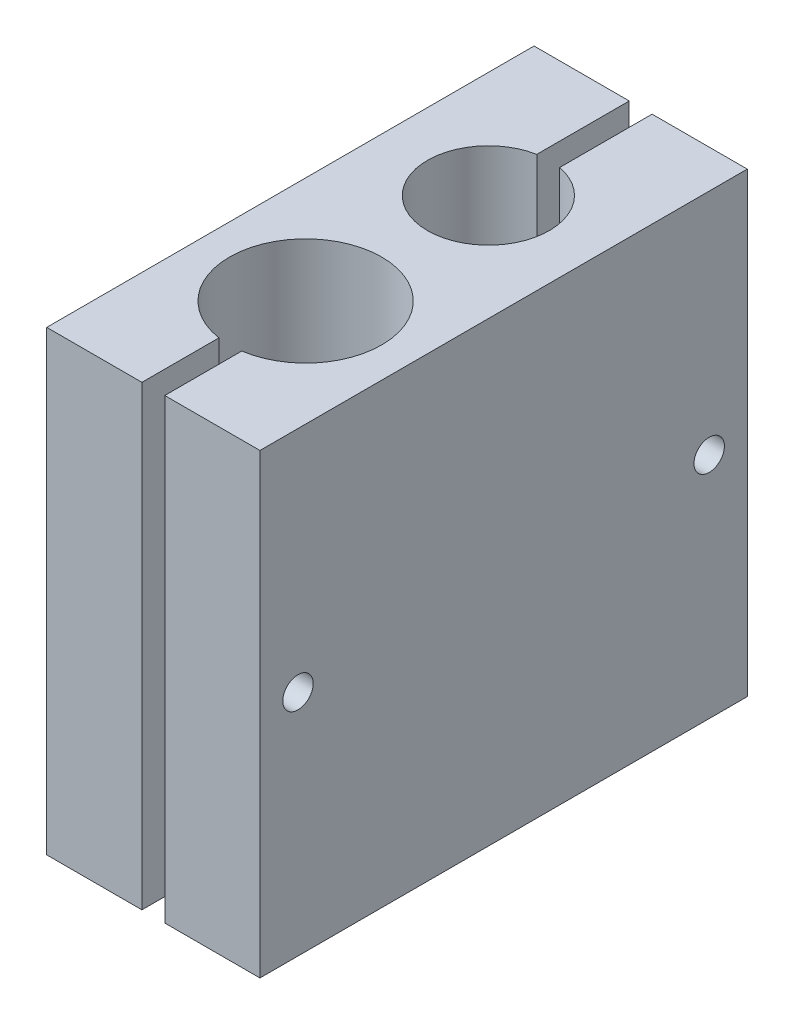
ISO-10303-21;
HEADER;
FILE_DESCRIPTION(('STEP AP214'),'2;1');
FILE_NAME('part.step','',(''),(''),'','','');
FILE_SCHEMA(('AUTOMOTIVE_DESIGN { 1 0 10303 214 1 1 1 1 }'));
ENDSEC;
DATA;
#1=APPLICATION_CONTEXT('core data for automotive mechanical design processes');
#2=APPLICATION_PROTOCOL_DEFINITION('international standard','automotive_design',2000,#1);
#3=PRODUCT_CONTEXT('',#1,'mechanical');
#4=PRODUCT('Part','Part','',(#3));
#5=PRODUCT_RELATED_PRODUCT_CATEGORY('part','',(#4));
#6=PRODUCT_DEFINITION_FORMATION('','',#4);
#7=PRODUCT_DEFINITION_CONTEXT('part definition',#1,'design');
#8=PRODUCT_DEFINITION('design','',#6,#7);
#9=PRODUCT_DEFINITION_SHAPE('','',#8);
#10=(LENGTH_UNIT() NAMED_UNIT(*) SI_UNIT(.MILLI.,.METRE.));
#11=(NAMED_UNIT(*) PLANE_ANGLE_UNIT() SI_UNIT($,.RADIAN.));
#12=(NAMED_UNIT(*) SI_UNIT($,.STERADIAN.) SOLID_ANGLE_UNIT());
#13=UNCERTAINTY_MEASURE_WITH_UNIT(LENGTH_MEASURE(1.E-05),#10,'distance_accuracy_value','');
#14=(GEOMETRIC_REPRESENTATION_CONTEXT(3) GLOBAL_UNCERTAINTY_ASSIGNED_CONTEXT((#13)) GLOBAL_UNIT_ASSIGNED_CONTEXT((#10,
#11,#12)) REPRESENTATION_CONTEXT('',''));
#15=CARTESIAN_POINT('',(0.,0.,0.));
#16=DIRECTION('',(0.,0.,1.));
#17=DIRECTION('',(1.,0.,0.));
#18=AXIS2_PLACEMENT_3D('',#15,#16,#17);
#19=CARTESIAN_POINT('',(-7.,30.,-22.));
#20=DIRECTION('',(0.,0.,1.));
#21=DIRECTION('',(1.,0.,0.));
#22=AXIS2_PLACEMENT_3D('',#19,#20,#21);
#23=PLANE('',#22);
#24=DIRECTION('',(-1.,0.,0.));
#25=VECTOR('',#24,1.);
#26=CARTESIAN_POINT('',(-7.,30.,-22.));
#27=LINE('',#26,#25);
#28=CARTESIAN_POINT('',(-0.749999999999994,30.,-22.));
#29=VERTEX_POINT('',#28);
#30=CARTESIAN_POINT('',(-7.,30.,-22.));
#31=VERTEX_POINT('',#30);
#32=EDGE_CURVE('E173',#29,#31,#27,.T.);
#33=ORIENTED_EDGE('',*,*,#32,.F.);
#34=DIRECTION('',(0.,-1.,0.));
#35=VECTOR('',#34,1.);
#36=CARTESIAN_POINT('',(-0.749999999999994,30.,-22.));
#37=LINE('',#36,#35);
#38=CARTESIAN_POINT('',(-0.749999999999994,0.,-22.));
#39=VERTEX_POINT('',#38);
#40=EDGE_CURVE('E229',#29,#39,#37,.T.);
#41=ORIENTED_EDGE('',*,*,#40,.T.);
#42=DIRECTION('',(-1.,0.,0.));
#43=VECTOR('',#42,1.);
#44=CARTESIAN_POINT('',(-7.,0.,-22.));
#45=LINE('',#44,#43);
#46=CARTESIAN_POINT('',(-7.,0.,-22.));
#47=VERTEX_POINT('',#46);
#48=EDGE_CURVE('E146',#39,#47,#45,.T.);
#49=ORIENTED_EDGE('',*,*,#48,.T.);
#50=DIRECTION('',(0.,-1.,0.));
#51=VECTOR('',#50,1.);
#52=CARTESIAN_POINT('',(-7.,30.,-22.));
#53=LINE('',#52,#51);
#54=EDGE_CURVE('E177',#31,#47,#53,.T.);
#55=ORIENTED_EDGE('',*,*,#54,.F.);
#56=EDGE_LOOP('',(#33,#41,#49,#55));
#57=FACE_BOUND('',#56,.T.);
#58=ADVANCED_FACE('F33',(#57),#23,.F.);
#59=CARTESIAN_POINT('',(-7.,30.,10.));
#60=DIRECTION('',(0.,0.,-1.));
#61=DIRECTION('',(-1.,0.,0.));
#62=AXIS2_PLACEMENT_3D('',#59,#60,#61);
#63=PLANE('',#62);
#64=DIRECTION('',(1.,0.,0.));
#65=VECTOR('',#64,1.);
#66=CARTESIAN_POINT('',(-7.,30.,10.));
#67=LINE('',#66,#65);
#68=CARTESIAN_POINT('',(0.749999999999998,30.,10.));
#69=VERTEX_POINT('',#68);
#70=CARTESIAN_POINT('',(7.,30.,10.));
#71=VERTEX_POINT('',#70);
#72=EDGE_CURVE('E166',#69,#71,#67,.T.);
#73=ORIENTED_EDGE('',*,*,#72,.F.);
#74=DIRECTION('',(0.,-1.,0.));
#75=VECTOR('',#74,1.);
#76=CARTESIAN_POINT('',(0.749999999999998,30.,10.));
#77=LINE('',#76,#75);
#78=CARTESIAN_POINT('',(0.749999999999998,0.,10.));
#79=VERTEX_POINT('',#78);
#80=EDGE_CURVE('E254',#69,#79,#77,.T.);
#81=ORIENTED_EDGE('',*,*,#80,.T.);
#82=DIRECTION('',(1.,0.,0.));
#83=VECTOR('',#82,1.);
#84=CARTESIAN_POINT('',(-7.,0.,10.));
#85=LINE('',#84,#83);
#86=CARTESIAN_POINT('',(7.,0.,10.));
#87=VERTEX_POINT('',#86);
#88=EDGE_CURVE('E180',#79,#87,#85,.T.);
#89=ORIENTED_EDGE('',*,*,#88,.T.);
#90=DIRECTION('',(0.,-1.,0.));
#91=VECTOR('',#90,1.);
#92=CARTESIAN_POINT('',(7.,30.,10.));
#93=LINE('',#92,#91);
#94=EDGE_CURVE('E193',#71,#87,#93,.T.);
#95=ORIENTED_EDGE('',*,*,#94,.F.);
#96=EDGE_LOOP('',(#73,#81,#89,#95));
#97=FACE_BOUND('',#96,.T.);
#98=ADVANCED_FACE('F288',(#97),#63,.F.);
#99=CARTESIAN_POINT('',(0.,30.,0.));
#100=DIRECTION('',(0.,-1.,0.));
#101=DIRECTION('',(0.,0.,-1.));
#102=AXIS2_PLACEMENT_3D('',#99,#100,#101);
#103=CYLINDRICAL_SURFACE('',#102,3.4);
#104=DIRECTION('',(0.,-1.,0.));
#105=VECTOR('',#104,1.);
#106=CARTESIAN_POINT('',(0.75,30.,3.31624787975809));
#107=LINE('',#106,#105);
#108=CARTESIAN_POINT('',(0.75,22.,3.31624787975809));
#109=VERTEX_POINT('',#108);
#110=CARTESIAN_POINT('',(0.75,0.,3.31624787975808));
#111=VERTEX_POINT('',#110);
#112=EDGE_CURVE('E252',#109,#111,#107,.T.);
#113=ORIENTED_EDGE('',*,*,#112,.F.);
#114=CARTESIAN_POINT('',(0.,22.,0.));
#115=DIRECTION('',(0.,1.,0.));
#116=DIRECTION('',(0.,0.,1.));
#117=AXIS2_PLACEMENT_3D('',#114,#115,#116);
#118=CIRCLE('',#117,3.4);
#119=CARTESIAN_POINT('',(-0.750000000000002,22.,3.31624787975809));
#120=VERTEX_POINT('',#119);
#121=EDGE_CURVE('E151',#109,#120,#118,.T.);
#122=ORIENTED_EDGE('',*,*,#121,.T.);
#123=DIRECTION('',(0.,-1.,0.));
#124=VECTOR('',#123,1.);
#125=CARTESIAN_POINT('',(-0.750000000000002,30.,3.31624787975809));
#126=LINE('',#125,#124);
#127=CARTESIAN_POINT('',(-0.750000000000002,0.,3.31624787975808));
#128=VERTEX_POINT('',#127);
#129=EDGE_CURVE('E244',#128,#120,#126,.F.);
#130=ORIENTED_EDGE('',*,*,#129,.F.);
#131=CARTESIAN_POINT('',(0.,0.,0.));
#132=DIRECTION('',(0.,1.,0.));
#133=DIRECTION('',(0.,0.,1.));
#134=AXIS2_PLACEMENT_3D('',#131,#132,#133);
#135=CIRCLE('',#134,3.4);
#136=EDGE_CURVE('E153',#111,#128,#135,.T.);
#137=ORIENTED_EDGE('',*,*,#136,.F.);
#138=EDGE_LOOP('',(#113,#122,#130,#137));
#139=FACE_BOUND('',#138,.T.);
#140=ADVANCED_FACE('F279',(#139),#103,.F.);
#141=CARTESIAN_POINT('',(0.,30.,0.));
#142=DIRECTION('',(0.,-1.,0.));
#143=DIRECTION('',(0.,0.,-1.));
#144=AXIS2_PLACEMENT_3D('',#141,#142,#143);
#145=PLANE('',#144);
#146=CARTESIAN_POINT('',(0.,30.,-12.));
#147=DIRECTION('',(0.,1.,0.));
#148=DIRECTION('',(0.,0.,1.));
#149=AXIS2_PLACEMENT_3D('',#146,#147,#148);
#150=CIRCLE('',#149,4.);
#151=CARTESIAN_POINT('',(-0.749999999999994,30.,-15.9290584113754));
#152=VERTEX_POINT('',#151);
#153=CARTESIAN_POINT('',(0.749999999999997,30.,-15.9290584113754));
#154=VERTEX_POINT('',#153);
#155=EDGE_CURVE('E150',#152,#154,#150,.T.);
#156=ORIENTED_EDGE('',*,*,#155,.F.);
#157=DIRECTION('',(0.,0.,-1.));
#158=VECTOR('',#157,1.);
#159=CARTESIAN_POINT('',(-0.749999999999993,30.,-32.0000000000002));
#160=LINE('',#159,#158);
#161=EDGE_CURVE('E57',#152,#29,#160,.T.);
#162=ORIENTED_EDGE('',*,*,#161,.T.);
#163=ORIENTED_EDGE('',*,*,#32,.T.);
#164=DIRECTION('',(0.,0.,1.));
#165=VECTOR('',#164,1.);
#166=CARTESIAN_POINT('',(-7.,30.,10.));
#167=LINE('',#166,#165);
#168=CARTESIAN_POINT('',(-7.,30.,10.));
#169=VERTEX_POINT('',#168);
#170=EDGE_CURVE('E163',#31,#169,#167,.T.);
#171=ORIENTED_EDGE('',*,*,#170,.T.);
#172=CARTESIAN_POINT('',(-0.750000000000003,30.,10.));
#173=VERTEX_POINT('',#172);
#174=EDGE_CURVE('E168',#169,#173,#67,.T.);
#175=ORIENTED_EDGE('',*,*,#174,.T.);
#176=DIRECTION('',(0.,0.,-1.));
#177=VECTOR('',#176,1.);
#178=CARTESIAN_POINT('',(-0.750000000000004,30.,19.9999999999999));
#179=LINE('',#178,#177);
#180=CARTESIAN_POINT('',(-0.750000000000002,30.,4.9434299833213));
#181=VERTEX_POINT('',#180);
#182=EDGE_CURVE('E235',#173,#181,#179,.T.);
#183=ORIENTED_EDGE('',*,*,#182,.T.);
#184=CARTESIAN_POINT('',(0.,30.,0.));
#185=DIRECTION('',(0.,1.,0.));
#186=DIRECTION('',(0.,0.,1.));
#187=AXIS2_PLACEMENT_3D('',#184,#185,#186);
#188=CIRCLE('',#187,5.);
#189=CARTESIAN_POINT('',(0.75,30.,4.9434299833213));
#190=VERTEX_POINT('',#189);
#191=EDGE_CURVE('E257',#190,#181,#188,.T.);
#192=ORIENTED_EDGE('',*,*,#191,.F.);
#193=DIRECTION('',(0.,0.,1.));
#194=VECTOR('',#193,1.);
#195=CARTESIAN_POINT('',(0.749999999999996,30.,19.9999999999999));
#196=LINE('',#195,#194);
#197=EDGE_CURVE('E232',#190,#69,#196,.T.);
#198=ORIENTED_EDGE('',*,*,#197,.T.);
#199=ORIENTED_EDGE('',*,*,#72,.T.);
#200=DIRECTION('',(0.,0.,-1.));
#201=VECTOR('',#200,1.);
#202=CARTESIAN_POINT('',(7.,30.,10.));
#203=LINE('',#202,#201);
#204=CARTESIAN_POINT('',(7.,30.,-22.));
#205=VERTEX_POINT('',#204);
#206=EDGE_CURVE('E171',#71,#205,#203,.T.);
#207=ORIENTED_EDGE('',*,*,#206,.T.);
#208=CARTESIAN_POINT('',(0.750000000000001,30.,-22.));
#209=VERTEX_POINT('',#208);
#210=EDGE_CURVE('E174',#205,#209,#27,.T.);
#211=ORIENTED_EDGE('',*,*,#210,.T.);
#212=DIRECTION('',(0.,0.,1.));
#213=VECTOR('',#212,1.);
#214=CARTESIAN_POINT('',(0.750000000000007,30.,-32.0000000000002));
#215=LINE('',#214,#213);
#216=EDGE_CURVE('E222',#209,#154,#215,.T.);
#217=ORIENTED_EDGE('',*,*,#216,.T.);
#218=EDGE_LOOP('',(#156,#162,#163,#171,#175,#183,#192,#198,#199,#207,#211,#217));
#219=FACE_BOUND('',#218,.T.);
#220=ADVANCED_FACE('F265',(#219),#145,.F.);
#221=CARTESIAN_POINT('',(0.,0.,0.));
#222=DIRECTION('',(0.,-1.,0.));
#223=DIRECTION('',(0.,0.,-1.));
#224=AXIS2_PLACEMENT_3D('',#221,#222,#223);
#225=PLANE('',#224);
#226=DIRECTION('',(0.,0.,-1.));
#227=VECTOR('',#226,1.);
#228=CARTESIAN_POINT('',(-0.749999999999993,0.,-32.0000000000002));
#229=LINE('',#228,#227);
#230=CARTESIAN_POINT('',(-0.749999999999994,0.,-15.9290584113754));
#231=VERTEX_POINT('',#230);
#232=EDGE_CURVE('E134',#231,#39,#229,.T.);
#233=ORIENTED_EDGE('',*,*,#232,.F.);
#234=CARTESIAN_POINT('',(0.,0.,-12.));
#235=DIRECTION('',(0.,1.,0.));
#236=DIRECTION('',(0.,0.,1.));
#237=AXIS2_PLACEMENT_3D('',#234,#235,#236);
#238=CIRCLE('',#237,4.);
#239=CARTESIAN_POINT('',(0.749999999999997,0.,-15.9290584113754));
#240=VERTEX_POINT('',#239);
#241=EDGE_CURVE('E144',#231,#240,#238,.T.);
#242=ORIENTED_EDGE('',*,*,#241,.T.);
#243=DIRECTION('',(0.,0.,1.));
#244=VECTOR('',#243,1.);
#245=CARTESIAN_POINT('',(0.750000000000007,0.,-32.0000000000002));
#246=LINE('',#245,#244);
#247=CARTESIAN_POINT('',(0.750000000000001,0.,-22.));
#248=VERTEX_POINT('',#247);
#249=EDGE_CURVE('E50',#248,#240,#246,.T.);
#250=ORIENTED_EDGE('',*,*,#249,.F.);
#251=CARTESIAN_POINT('',(7.,0.,-22.));
#252=VERTEX_POINT('',#251);
#253=EDGE_CURVE('E167',#252,#248,#45,.T.);
#254=ORIENTED_EDGE('',*,*,#253,.F.);
#255=DIRECTION('',(0.,0.,-1.));
#256=VECTOR('',#255,1.);
#257=CARTESIAN_POINT('',(7.,0.,10.));
#258=LINE('',#257,#256);
#259=EDGE_CURVE('E184',#87,#252,#258,.T.);
#260=ORIENTED_EDGE('',*,*,#259,.F.);
#261=ORIENTED_EDGE('',*,*,#88,.F.);
#262=DIRECTION('',(0.,0.,1.));
#263=VECTOR('',#262,1.);
#264=CARTESIAN_POINT('',(0.749999999999996,0.,19.9999999999999));
#265=LINE('',#264,#263);
#266=EDGE_CURVE('E231',#111,#79,#265,.T.);
#267=ORIENTED_EDGE('',*,*,#266,.F.);
#268=ORIENTED_EDGE('',*,*,#136,.T.);
#269=DIRECTION('',(0.,0.,-1.));
#270=VECTOR('',#269,1.);
#271=CARTESIAN_POINT('',(-0.750000000000004,0.,19.9999999999999));
#272=LINE('',#271,#270);
#273=CARTESIAN_POINT('',(-0.750000000000003,0.,10.));
#274=VERTEX_POINT('',#273);
#275=EDGE_CURVE('E236',#274,#128,#272,.T.);
#276=ORIENTED_EDGE('',*,*,#275,.F.);
#277=CARTESIAN_POINT('',(-7.,0.,10.));
#278=VERTEX_POINT('',#277);
#279=EDGE_CURVE('E181',#278,#274,#85,.T.);
#280=ORIENTED_EDGE('',*,*,#279,.F.);
#281=DIRECTION('',(0.,0.,1.));
#282=VECTOR('',#281,1.);
#283=CARTESIAN_POINT('',(-7.,0.,10.));
#284=LINE('',#283,#282);
#285=EDGE_CURVE('E162',#47,#278,#284,.T.);
#286=ORIENTED_EDGE('',*,*,#285,.F.);
#287=ORIENTED_EDGE('',*,*,#48,.F.);
#288=EDGE_LOOP('',(#233,#242,#250,#254,#260,#261,#267,#268,#276,#280,#286,#287));
#289=FACE_BOUND('',#288,.T.);
#290=ADVANCED_FACE('F143',(#289),#225,.T.);
#291=CARTESIAN_POINT('',(-7.,30.,10.));
#292=DIRECTION('',(1.,0.,0.));
#293=DIRECTION('',(0.,0.,-1.));
#294=AXIS2_PLACEMENT_3D('',#291,#292,#293);
#295=PLANE('',#294);
#296=CARTESIAN_POINT('',(-7.,15.,-19.5));
#297=DIRECTION('',(-1.,0.,0.));
#298=DIRECTION('',(0.,0.,1.));
#299=AXIS2_PLACEMENT_3D('',#296,#297,#298);
#300=CIRCLE('',#299,1.);
#301=CARTESIAN_POINT('',(-7.,15.,-18.5));
#302=VERTEX_POINT('',#301);
#303=EDGE_CURVE('E336',#302,#302,#300,.T.);
#304=ORIENTED_EDGE('',*,*,#303,.F.);
#305=EDGE_LOOP('',(#304));
#306=FACE_BOUND('',#305,.T.);
#307=CARTESIAN_POINT('',(-7.,15.,7.5));
#308=DIRECTION('',(-1.,0.,0.));
#309=DIRECTION('',(0.,0.,1.));
#310=AXIS2_PLACEMENT_3D('',#307,#308,#309);
#311=CIRCLE('',#310,1.);
#312=CARTESIAN_POINT('',(-7.,15.,8.5));
#313=VERTEX_POINT('',#312);
#314=EDGE_CURVE('E211',#313,#313,#311,.T.);
#315=ORIENTED_EDGE('',*,*,#314,.F.);
#316=EDGE_LOOP('',(#315));
#317=FACE_BOUND('',#316,.T.);
#318=ORIENTED_EDGE('',*,*,#285,.T.);
#319=DIRECTION('',(0.,-1.,0.));
#320=VECTOR('',#319,1.);
#321=CARTESIAN_POINT('',(-7.,30.,10.));
#322=LINE('',#321,#320);
#323=EDGE_CURVE('E196',#169,#278,#322,.T.);
#324=ORIENTED_EDGE('',*,*,#323,.F.);
#325=ORIENTED_EDGE('',*,*,#170,.F.);
#326=ORIENTED_EDGE('',*,*,#54,.T.);
#327=EDGE_LOOP('',(#318,#324,#325,#326));
#328=FACE_BOUND('',#327,.T.);
#329=ADVANCED_FACE('F35',(#306,#317,#328),#295,.F.);
#330=ORIENTED_EDGE('',*,*,#279,.T.);
#331=DIRECTION('',(0.,1.,0.));
#332=VECTOR('',#331,1.);
#333=CARTESIAN_POINT('',(-0.750000000000002,30.,10.));
#334=LINE('',#333,#332);
#335=EDGE_CURVE('E246',#274,#173,#334,.T.);
#336=ORIENTED_EDGE('',*,*,#335,.T.);
#337=ORIENTED_EDGE('',*,*,#174,.F.);
#338=ORIENTED_EDGE('',*,*,#323,.T.);
#339=EDGE_LOOP('',(#330,#336,#337,#338));
#340=FACE_BOUND('',#339,.T.);
#341=ADVANCED_FACE('F271',(#340),#63,.F.);
#342=CARTESIAN_POINT('',(7.,30.,10.));
#343=DIRECTION('',(-1.,0.,0.));
#344=DIRECTION('',(0.,0.,1.));
#345=AXIS2_PLACEMENT_3D('',#342,#343,#344);
#346=PLANE('',#345);
#347=CARTESIAN_POINT('',(7.,15.,-19.5));
#348=DIRECTION('',(-1.,0.,0.));
#349=DIRECTION('',(0.,0.,1.));
#350=AXIS2_PLACEMENT_3D('',#347,#348,#349);
#351=CIRCLE('',#350,1.);
#352=CARTESIAN_POINT('',(7.,15.,-18.5));
#353=VERTEX_POINT('',#352);
#354=EDGE_CURVE('E334',#353,#353,#351,.T.);
#355=ORIENTED_EDGE('',*,*,#354,.T.);
#356=EDGE_LOOP('',(#355));
#357=FACE_BOUND('',#356,.T.);
#358=CARTESIAN_POINT('',(7.,15.,7.5));
#359=DIRECTION('',(-1.,0.,0.));
#360=DIRECTION('',(0.,0.,1.));
#361=AXIS2_PLACEMENT_3D('',#358,#359,#360);
#362=CIRCLE('',#361,1.);
#363=CARTESIAN_POINT('',(7.,15.,8.5));
#364=VERTEX_POINT('',#363);
#365=EDGE_CURVE('E205',#364,#364,#362,.T.);
#366=ORIENTED_EDGE('',*,*,#365,.T.);
#367=EDGE_LOOP('',(#366));
#368=FACE_BOUND('',#367,.T.);
#369=ORIENTED_EDGE('',*,*,#259,.T.);
#370=DIRECTION('',(0.,-1.,0.));
#371=VECTOR('',#370,1.);
#372=CARTESIAN_POINT('',(7.,30.,-22.));
#373=LINE('',#372,#371);
#374=EDGE_CURVE('E190',#205,#252,#373,.T.);
#375=ORIENTED_EDGE('',*,*,#374,.F.);
#376=ORIENTED_EDGE('',*,*,#206,.F.);
#377=ORIENTED_EDGE('',*,*,#94,.T.);
#378=EDGE_LOOP('',(#369,#375,#376,#377));
#379=FACE_BOUND('',#378,.T.);
#380=ADVANCED_FACE('F294',(#357,#368,#379),#346,.F.);
#381=ORIENTED_EDGE('',*,*,#253,.T.);
#382=DIRECTION('',(0.,1.,0.));
#383=VECTOR('',#382,1.);
#384=CARTESIAN_POINT('',(0.750000000000002,30.,-22.));
#385=LINE('',#384,#383);
#386=EDGE_CURVE('E224',#248,#209,#385,.T.);
#387=ORIENTED_EDGE('',*,*,#386,.T.);
#388=ORIENTED_EDGE('',*,*,#210,.F.);
#389=ORIENTED_EDGE('',*,*,#374,.T.);
#390=EDGE_LOOP('',(#381,#387,#388,#389));
#391=FACE_BOUND('',#390,.T.);
#392=ADVANCED_FACE('F298',(#391),#23,.F.);
#393=CARTESIAN_POINT('',(0.,30.,-12.));
#394=DIRECTION('',(0.,-1.,0.));
#395=DIRECTION('',(0.,0.,-1.));
#396=AXIS2_PLACEMENT_3D('',#393,#394,#395);
#397=CYLINDRICAL_SURFACE('',#396,4.);
#398=DIRECTION('',(0.,-1.,0.));
#399=VECTOR('',#398,1.);
#400=CARTESIAN_POINT('',(-0.749999999999994,30.,-15.9290584113754));
#401=LINE('',#400,#399);
#402=EDGE_CURVE('E11',#152,#231,#401,.T.);
#403=ORIENTED_EDGE('',*,*,#402,.F.);
#404=ORIENTED_EDGE('',*,*,#155,.T.);
#405=DIRECTION('',(0.,-1.,0.));
#406=VECTOR('',#405,1.);
#407=CARTESIAN_POINT('',(0.749999999999997,30.,-15.9290584113754));
#408=LINE('',#407,#406);
#409=EDGE_CURVE('E42',#240,#154,#408,.F.);
#410=ORIENTED_EDGE('',*,*,#409,.F.);
#411=ORIENTED_EDGE('',*,*,#241,.F.);
#412=EDGE_LOOP('',(#403,#404,#410,#411));
#413=FACE_BOUND('',#412,.T.);
#414=ADVANCED_FACE('F149',(#413),#397,.F.);
#415=CARTESIAN_POINT('',(0.,22.,0.));
#416=DIRECTION('',(0.,1.,0.));
#417=DIRECTION('',(0.,0.,1.));
#418=AXIS2_PLACEMENT_3D('',#415,#416,#417);
#419=CYLINDRICAL_SURFACE('',#418,5.);
#420=CARTESIAN_POINT('',(0.,22.,0.));
#421=DIRECTION('',(0.,1.,0.));
#422=DIRECTION('',(0.,0.,1.));
#423=AXIS2_PLACEMENT_3D('',#420,#421,#422);
#424=CIRCLE('',#423,5.);
#425=CARTESIAN_POINT('',(0.75,22.,4.9434299833213));
#426=VERTEX_POINT('',#425);
#427=CARTESIAN_POINT('',(-0.750000000000002,22.,4.9434299833213));
#428=VERTEX_POINT('',#427);
#429=EDGE_CURVE('E156',#426,#428,#424,.T.);
#430=ORIENTED_EDGE('',*,*,#429,.F.);
#431=DIRECTION('',(0.,1.,0.));
#432=VECTOR('',#431,1.);
#433=CARTESIAN_POINT('',(0.75,22.,4.9434299833213));
#434=LINE('',#433,#432);
#435=EDGE_CURVE('E249',#426,#190,#434,.T.);
#436=ORIENTED_EDGE('',*,*,#435,.T.);
#437=ORIENTED_EDGE('',*,*,#191,.T.);
#438=DIRECTION('',(0.,1.,0.));
#439=VECTOR('',#438,1.);
#440=CARTESIAN_POINT('',(-0.750000000000002,22.,4.9434299833213));
#441=LINE('',#440,#439);
#442=EDGE_CURVE('E239',#181,#428,#441,.F.);
#443=ORIENTED_EDGE('',*,*,#442,.T.);
#444=EDGE_LOOP('',(#430,#436,#437,#443));
#445=FACE_BOUND('',#444,.T.);
#446=ADVANCED_FACE('F263',(#445),#419,.F.);
#447=CARTESIAN_POINT('',(0.,22.,0.));
#448=DIRECTION('',(0.,1.,0.));
#449=DIRECTION('',(0.,0.,1.));
#450=AXIS2_PLACEMENT_3D('',#447,#448,#449);
#451=PLANE('',#450);
#452=DIRECTION('',(0.,0.,-1.));
#453=VECTOR('',#452,1.);
#454=CARTESIAN_POINT('',(0.750000000000001,22.,0.));
#455=LINE('',#454,#453);
#456=EDGE_CURVE('E201',#426,#109,#455,.T.);
#457=ORIENTED_EDGE('',*,*,#456,.F.);
#458=ORIENTED_EDGE('',*,*,#429,.T.);
#459=DIRECTION('',(0.,0.,1.));
#460=VECTOR('',#459,1.);
#461=CARTESIAN_POINT('',(-0.750000000000001,22.,0.));
#462=LINE('',#461,#460);
#463=EDGE_CURVE('E198',#120,#428,#462,.T.);
#464=ORIENTED_EDGE('',*,*,#463,.F.);
#465=ORIENTED_EDGE('',*,*,#121,.F.);
#466=EDGE_LOOP('',(#457,#458,#464,#465));
#467=FACE_BOUND('',#466,.T.);
#468=ADVANCED_FACE('F283',(#467),#451,.T.);
#469=CARTESIAN_POINT('',(-0.750000000000004,30.,19.9999999999999));
#470=DIRECTION('',(-1.,0.,0.));
#471=DIRECTION('',(0.,0.,1.));
#472=AXIS2_PLACEMENT_3D('',#469,#470,#471);
#473=PLANE('',#472);
#474=CARTESIAN_POINT('',(-0.750000000000002,15.,7.5));
#475=DIRECTION('',(-1.,0.,0.));
#476=DIRECTION('',(0.,0.,1.));
#477=AXIS2_PLACEMENT_3D('',#474,#475,#476);
#478=CIRCLE('',#477,1.);
#479=CARTESIAN_POINT('',(-0.750000000000003,15.,8.5));
#480=VERTEX_POINT('',#479);
#481=EDGE_CURVE('E147',#480,#480,#478,.T.);
#482=ORIENTED_EDGE('',*,*,#481,.T.);
#483=EDGE_LOOP('',(#482));
#484=FACE_BOUND('',#483,.T.);
#485=ORIENTED_EDGE('',*,*,#275,.T.);
#486=ORIENTED_EDGE('',*,*,#129,.T.);
#487=ORIENTED_EDGE('',*,*,#463,.T.);
#488=ORIENTED_EDGE('',*,*,#442,.F.);
#489=ORIENTED_EDGE('',*,*,#182,.F.);
#490=ORIENTED_EDGE('',*,*,#335,.F.);
#491=EDGE_LOOP('',(#485,#486,#487,#488,#489,#490));
#492=FACE_BOUND('',#491,.T.);
#493=ADVANCED_FACE('F268',(#484,#492),#473,.F.);
#494=CARTESIAN_POINT('',(0.749999999999996,30.,19.9999999999999));
#495=DIRECTION('',(1.,0.,0.));
#496=DIRECTION('',(0.,0.,-1.));
#497=AXIS2_PLACEMENT_3D('',#494,#495,#496);
#498=PLANE('',#497);
#499=CARTESIAN_POINT('',(0.749999999999999,15.,7.5));
#500=DIRECTION('',(1.,0.,0.));
#501=DIRECTION('',(0.,0.,-1.));
#502=AXIS2_PLACEMENT_3D('',#499,#500,#501);
#503=CIRCLE('',#502,1.);
#504=CARTESIAN_POINT('',(0.749999999999999,15.,6.49999999999999));
#505=VERTEX_POINT('',#504);
#506=EDGE_CURVE('E203',#505,#505,#503,.T.);
#507=ORIENTED_EDGE('',*,*,#506,.T.);
#508=EDGE_LOOP('',(#507));
#509=FACE_BOUND('',#508,.T.);
#510=ORIENTED_EDGE('',*,*,#197,.F.);
#511=ORIENTED_EDGE('',*,*,#435,.F.);
#512=ORIENTED_EDGE('',*,*,#456,.T.);
#513=ORIENTED_EDGE('',*,*,#112,.T.);
#514=ORIENTED_EDGE('',*,*,#266,.T.);
#515=ORIENTED_EDGE('',*,*,#80,.F.);
#516=EDGE_LOOP('',(#510,#511,#512,#513,#514,#515));
#517=FACE_BOUND('',#516,.T.);
#518=ADVANCED_FACE('F285',(#509,#517),#498,.F.);
#519=CARTESIAN_POINT('',(0.750000000000007,30.,-32.0000000000002));
#520=DIRECTION('',(1.,0.,0.));
#521=DIRECTION('',(0.,0.,-1.));
#522=AXIS2_PLACEMENT_3D('',#519,#520,#521);
#523=PLANE('',#522);
#524=CARTESIAN_POINT('',(0.75,15.,-19.5));
#525=DIRECTION('',(1.,0.,0.));
#526=DIRECTION('',(0.,0.,-1.));
#527=AXIS2_PLACEMENT_3D('',#524,#525,#526);
#528=CIRCLE('',#527,1.);
#529=CARTESIAN_POINT('',(0.75,15.,-20.5));
#530=VERTEX_POINT('',#529);
#531=EDGE_CURVE('E216',#530,#530,#528,.T.);
#532=ORIENTED_EDGE('',*,*,#531,.T.);
#533=EDGE_LOOP('',(#532));
#534=FACE_BOUND('',#533,.T.);
#535=ORIENTED_EDGE('',*,*,#249,.T.);
#536=ORIENTED_EDGE('',*,*,#409,.T.);
#537=ORIENTED_EDGE('',*,*,#216,.F.);
#538=ORIENTED_EDGE('',*,*,#386,.F.);
#539=EDGE_LOOP('',(#535,#536,#537,#538));
#540=FACE_BOUND('',#539,.T.);
#541=ADVANCED_FACE('F299',(#534,#540),#523,.F.);
#542=CARTESIAN_POINT('',(-0.749999999999993,30.,-32.0000000000002));
#543=DIRECTION('',(-1.,0.,0.));
#544=DIRECTION('',(0.,0.,1.));
#545=AXIS2_PLACEMENT_3D('',#542,#543,#544);
#546=PLANE('',#545);
#547=CARTESIAN_POINT('',(-0.749999999999995,15.,-19.5));
#548=DIRECTION('',(-1.,0.,0.));
#549=DIRECTION('',(0.,0.,1.));
#550=AXIS2_PLACEMENT_3D('',#547,#548,#549);
#551=CIRCLE('',#550,1.);
#552=CARTESIAN_POINT('',(-0.749999999999995,15.,-18.5));
#553=VERTEX_POINT('',#552);
#554=EDGE_CURVE('E37',#553,#553,#551,.T.);
#555=ORIENTED_EDGE('',*,*,#554,.T.);
#556=EDGE_LOOP('',(#555));
#557=FACE_BOUND('',#556,.T.);
#558=ORIENTED_EDGE('',*,*,#161,.F.);
#559=ORIENTED_EDGE('',*,*,#402,.T.);
#560=ORIENTED_EDGE('',*,*,#232,.T.);
#561=ORIENTED_EDGE('',*,*,#40,.F.);
#562=EDGE_LOOP('',(#558,#559,#560,#561));
#563=FACE_BOUND('',#562,.T.);
#564=ADVANCED_FACE('F133',(#557,#563),#546,.F.);
#565=CARTESIAN_POINT('',(7.,15.,7.5));
#566=DIRECTION('',(-1.,0.,0.));
#567=DIRECTION('',(0.,0.,1.));
#568=AXIS2_PLACEMENT_3D('',#565,#566,#567);
#569=CYLINDRICAL_SURFACE('',#568,1.);
#570=ORIENTED_EDGE('',*,*,#365,.F.);
#571=EDGE_LOOP('',(#570));
#572=FACE_BOUND('',#571,.T.);
#573=ORIENTED_EDGE('',*,*,#506,.F.);
#574=EDGE_LOOP('',(#573));
#575=FACE_BOUND('',#574,.T.);
#576=ADVANCED_FACE('F307',(#572,#575),#569,.F.);
#577=ORIENTED_EDGE('',*,*,#314,.T.);
#578=EDGE_LOOP('',(#577));
#579=FACE_BOUND('',#578,.T.);
#580=ORIENTED_EDGE('',*,*,#481,.F.);
#581=EDGE_LOOP('',(#580));
#582=FACE_BOUND('',#581,.T.);
#583=ADVANCED_FACE('F352',(#579,#582),#569,.F.);
#584=CARTESIAN_POINT('',(7.,15.,-19.5));
#585=DIRECTION('',(-1.,0.,0.));
#586=DIRECTION('',(0.,0.,1.));
#587=AXIS2_PLACEMENT_3D('',#584,#585,#586);
#588=CYLINDRICAL_SURFACE('',#587,1.);
#589=ORIENTED_EDGE('',*,*,#303,.T.);
#590=EDGE_LOOP('',(#589));
#591=FACE_BOUND('',#590,.T.);
#592=ORIENTED_EDGE('',*,*,#554,.F.);
#593=EDGE_LOOP('',(#592));
#594=FACE_BOUND('',#593,.T.);
#595=ADVANCED_FACE('F342',(#591,#594),#588,.F.);
#596=ORIENTED_EDGE('',*,*,#354,.F.);
#597=EDGE_LOOP('',(#596));
#598=FACE_BOUND('',#597,.T.);
#599=ORIENTED_EDGE('',*,*,#531,.F.);
#600=EDGE_LOOP('',(#599));
#601=FACE_BOUND('',#600,.T.);
#602=ADVANCED_FACE('F456',(#598,#601),#588,.F.);
#603=CLOSED_SHELL('',(#58,#98,#140,#220,#290,#329,#341,#380,#392,#414,#446,#468,#493,#518,#541,
#564,#576,#583,#595,#602));
#604=MANIFOLD_SOLID_BREP('B2',#603);
#605=ADVANCED_BREP_SHAPE_REPRESENTATION('',(#18,#604),#14);
#606=SHAPE_DEFINITION_REPRESENTATION(#9,#605);
ENDSEC;
END-ISO-10303-21;
